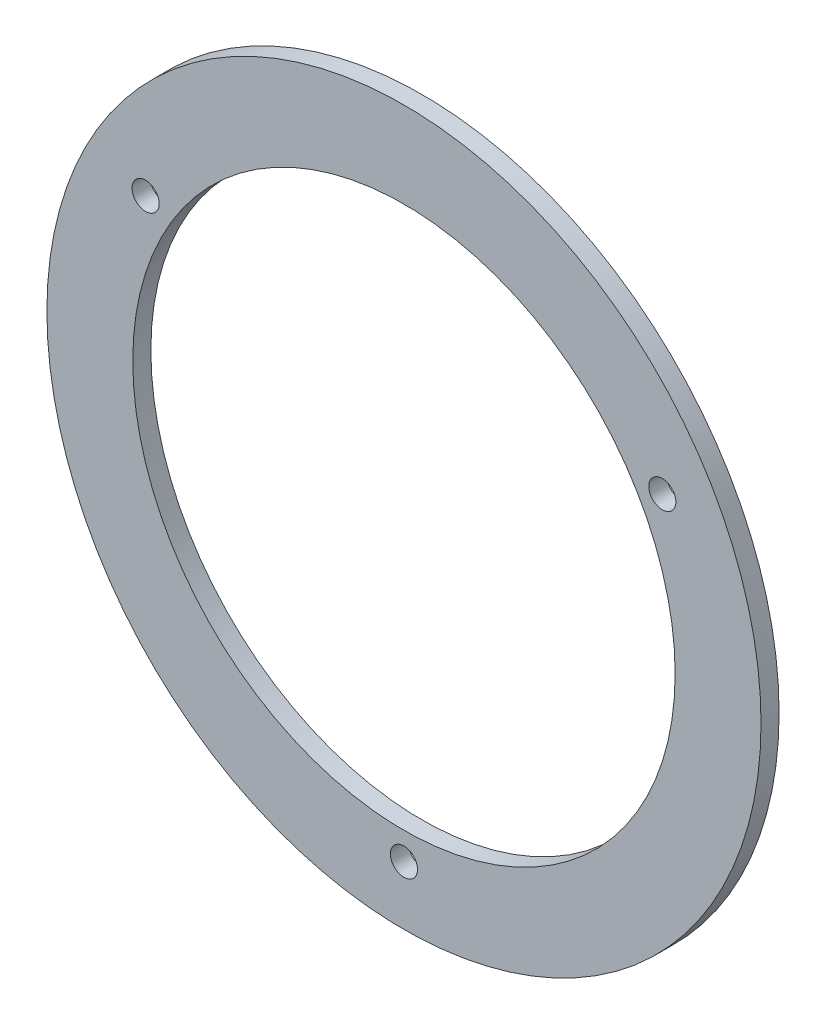
ISO-10303-21;
HEADER;
FILE_DESCRIPTION(('STEP AP214'),'2;1');
FILE_NAME('part.step','',(''),(''),'','','');
FILE_SCHEMA(('AUTOMOTIVE_DESIGN { 1 0 10303 214 1 1 1 1 }'));
ENDSEC;
DATA;
#1=APPLICATION_CONTEXT('core data for automotive mechanical design processes');
#2=APPLICATION_PROTOCOL_DEFINITION('international standard','automotive_design',2000,#1);
#3=PRODUCT_CONTEXT('',#1,'mechanical');
#4=PRODUCT('Part','Part','',(#3));
#5=PRODUCT_RELATED_PRODUCT_CATEGORY('part','',(#4));
#6=PRODUCT_DEFINITION_FORMATION('','',#4);
#7=PRODUCT_DEFINITION_CONTEXT('part definition',#1,'design');
#8=PRODUCT_DEFINITION('design','',#6,#7);
#9=PRODUCT_DEFINITION_SHAPE('','',#8);
#10=(LENGTH_UNIT() NAMED_UNIT(*) SI_UNIT(.MILLI.,.METRE.));
#11=(NAMED_UNIT(*) PLANE_ANGLE_UNIT() SI_UNIT($,.RADIAN.));
#12=(NAMED_UNIT(*) SI_UNIT($,.STERADIAN.) SOLID_ANGLE_UNIT());
#13=UNCERTAINTY_MEASURE_WITH_UNIT(LENGTH_MEASURE(1.E-05),#10,'distance_accuracy_value','');
#14=(GEOMETRIC_REPRESENTATION_CONTEXT(3) GLOBAL_UNCERTAINTY_ASSIGNED_CONTEXT((#13)) GLOBAL_UNIT_ASSIGNED_CONTEXT((#10,
#11,#12)) REPRESENTATION_CONTEXT('',''));
#15=CARTESIAN_POINT('',(0.,0.,0.));
#16=DIRECTION('',(0.,0.,1.));
#17=DIRECTION('',(1.,0.,0.));
#18=AXIS2_PLACEMENT_3D('',#15,#16,#17);
#19=CARTESIAN_POINT('',(0.,0.,2.));
#20=DIRECTION('',(0.,0.,1.));
#21=DIRECTION('',(1.,0.,0.));
#22=AXIS2_PLACEMENT_3D('',#19,#20,#21);
#23=PLANE('',#22);
#24=CARTESIAN_POINT('',(0.,-33.,2.));
#25=DIRECTION('',(0.,0.,1.));
#26=DIRECTION('',(1.,0.,0.));
#27=AXIS2_PLACEMENT_3D('',#24,#25,#26);
#28=CIRCLE('',#27,1.5);
#29=CARTESIAN_POINT('',(1.5,-33.,2.));
#30=VERTEX_POINT('',#29);
#31=EDGE_CURVE('E61',#30,#30,#28,.T.);
#32=ORIENTED_EDGE('',*,*,#31,.F.);
#33=EDGE_LOOP('',(#32));
#34=FACE_BOUND('',#33,.T.);
#35=CARTESIAN_POINT('',(-28.5788383248864,16.5000000000001,2.));
#36=DIRECTION('',(0.,0.,1.));
#37=DIRECTION('',(1.,0.,0.));
#38=AXIS2_PLACEMENT_3D('',#35,#36,#37);
#39=CIRCLE('',#38,1.5);
#40=CARTESIAN_POINT('',(-27.0788383248864,16.5000000000001,2.));
#41=VERTEX_POINT('',#40);
#42=EDGE_CURVE('E55',#41,#41,#39,.T.);
#43=ORIENTED_EDGE('',*,*,#42,.F.);
#44=EDGE_LOOP('',(#43));
#45=FACE_BOUND('',#44,.T.);
#46=CARTESIAN_POINT('',(28.5788383248866,16.4999999999997,2.));
#47=DIRECTION('',(0.,0.,1.));
#48=DIRECTION('',(1.,0.,0.));
#49=AXIS2_PLACEMENT_3D('',#46,#47,#48);
#50=CIRCLE('',#49,1.5);
#51=CARTESIAN_POINT('',(30.0788383248866,16.4999999999997,2.));
#52=VERTEX_POINT('',#51);
#53=EDGE_CURVE('E49',#52,#52,#50,.T.);
#54=ORIENTED_EDGE('',*,*,#53,.F.);
#55=EDGE_LOOP('',(#54));
#56=FACE_BOUND('',#55,.T.);
#57=CARTESIAN_POINT('',(0.,0.,2.));
#58=DIRECTION('',(0.,0.,1.));
#59=DIRECTION('',(1.,0.,0.));
#60=AXIS2_PLACEMENT_3D('',#57,#58,#59);
#61=CIRCLE('',#60,39.5);
#62=CARTESIAN_POINT('',(39.5,0.,2.));
#63=VERTEX_POINT('',#62);
#64=EDGE_CURVE('E10',#63,#63,#61,.T.);
#65=ORIENTED_EDGE('',*,*,#64,.T.);
#66=EDGE_LOOP('',(#65));
#67=FACE_BOUND('',#66,.T.);
#68=CARTESIAN_POINT('',(0.,0.,2.));
#69=DIRECTION('',(0.,0.,1.));
#70=DIRECTION('',(1.,0.,0.));
#71=AXIS2_PLACEMENT_3D('',#68,#69,#70);
#72=CIRCLE('',#71,30.);
#73=CARTESIAN_POINT('',(30.,0.,2.));
#74=VERTEX_POINT('',#73);
#75=EDGE_CURVE('E41',#74,#74,#72,.T.);
#76=ORIENTED_EDGE('',*,*,#75,.F.);
#77=EDGE_LOOP('',(#76));
#78=FACE_BOUND('',#77,.T.);
#79=ADVANCED_FACE('F30',(#34,#45,#56,#67,#78),#23,.T.);
#80=CARTESIAN_POINT('',(0.,0.,0.));
#81=DIRECTION('',(0.,0.,1.));
#82=DIRECTION('',(1.,0.,0.));
#83=AXIS2_PLACEMENT_3D('',#80,#81,#82);
#84=PLANE('',#83);
#85=CARTESIAN_POINT('',(0.,-33.,0.));
#86=DIRECTION('',(0.,0.,1.));
#87=DIRECTION('',(1.,0.,0.));
#88=AXIS2_PLACEMENT_3D('',#85,#86,#87);
#89=CIRCLE('',#88,1.5);
#90=CARTESIAN_POINT('',(1.5,-33.,0.));
#91=VERTEX_POINT('',#90);
#92=EDGE_CURVE('E46',#91,#91,#89,.T.);
#93=ORIENTED_EDGE('',*,*,#92,.T.);
#94=EDGE_LOOP('',(#93));
#95=FACE_BOUND('',#94,.T.);
#96=CARTESIAN_POINT('',(-28.5788383248864,16.5000000000001,0.));
#97=DIRECTION('',(0.,0.,1.));
#98=DIRECTION('',(1.,0.,0.));
#99=AXIS2_PLACEMENT_3D('',#96,#97,#98);
#100=CIRCLE('',#99,1.5);
#101=CARTESIAN_POINT('',(-27.0788383248864,16.5000000000001,0.));
#102=VERTEX_POINT('',#101);
#103=EDGE_CURVE('E58',#102,#102,#100,.T.);
#104=ORIENTED_EDGE('',*,*,#103,.T.);
#105=EDGE_LOOP('',(#104));
#106=FACE_BOUND('',#105,.T.);
#107=CARTESIAN_POINT('',(28.5788383248866,16.4999999999997,0.));
#108=DIRECTION('',(0.,0.,1.));
#109=DIRECTION('',(1.,0.,0.));
#110=AXIS2_PLACEMENT_3D('',#107,#108,#109);
#111=CIRCLE('',#110,1.5);
#112=CARTESIAN_POINT('',(30.0788383248866,16.4999999999997,0.));
#113=VERTEX_POINT('',#112);
#114=EDGE_CURVE('E52',#113,#113,#111,.T.);
#115=ORIENTED_EDGE('',*,*,#114,.T.);
#116=EDGE_LOOP('',(#115));
#117=FACE_BOUND('',#116,.T.);
#118=CARTESIAN_POINT('',(0.,0.,0.));
#119=DIRECTION('',(0.,0.,1.));
#120=DIRECTION('',(1.,0.,0.));
#121=AXIS2_PLACEMENT_3D('',#118,#119,#120);
#122=CIRCLE('',#121,39.5);
#123=CARTESIAN_POINT('',(39.5,0.,0.));
#124=VERTEX_POINT('',#123);
#125=EDGE_CURVE('E34',#124,#124,#122,.T.);
#126=ORIENTED_EDGE('',*,*,#125,.F.);
#127=EDGE_LOOP('',(#126));
#128=FACE_BOUND('',#127,.T.);
#129=CARTESIAN_POINT('',(0.,0.,0.));
#130=DIRECTION('',(0.,0.,1.));
#131=DIRECTION('',(1.,0.,0.));
#132=AXIS2_PLACEMENT_3D('',#129,#130,#131);
#133=CIRCLE('',#132,30.);
#134=CARTESIAN_POINT('',(30.,0.,0.));
#135=VERTEX_POINT('',#134);
#136=EDGE_CURVE('E43',#135,#135,#133,.T.);
#137=ORIENTED_EDGE('',*,*,#136,.T.);
#138=EDGE_LOOP('',(#137));
#139=FACE_BOUND('',#138,.T.);
#140=ADVANCED_FACE('F67',(#95,#106,#117,#128,#139),#84,.F.);
#141=CARTESIAN_POINT('',(0.,0.,2.));
#142=DIRECTION('',(0.,0.,-1.));
#143=DIRECTION('',(-1.,0.,0.));
#144=AXIS2_PLACEMENT_3D('',#141,#142,#143);
#145=CYLINDRICAL_SURFACE('',#144,39.5);
#146=ORIENTED_EDGE('',*,*,#64,.F.);
#147=EDGE_LOOP('',(#146));
#148=FACE_BOUND('',#147,.T.);
#149=ORIENTED_EDGE('',*,*,#125,.T.);
#150=EDGE_LOOP('',(#149));
#151=FACE_BOUND('',#150,.T.);
#152=ADVANCED_FACE('F32',(#148,#151),#145,.T.);
#153=CARTESIAN_POINT('',(0.,0.,2.));
#154=DIRECTION('',(0.,0.,-1.));
#155=DIRECTION('',(-1.,0.,0.));
#156=AXIS2_PLACEMENT_3D('',#153,#154,#155);
#157=CYLINDRICAL_SURFACE('',#156,30.);
#158=ORIENTED_EDGE('',*,*,#75,.T.);
#159=EDGE_LOOP('',(#158));
#160=FACE_BOUND('',#159,.T.);
#161=ORIENTED_EDGE('',*,*,#136,.F.);
#162=EDGE_LOOP('',(#161));
#163=FACE_BOUND('',#162,.T.);
#164=ADVANCED_FACE('F86',(#160,#163),#157,.F.);
#165=CARTESIAN_POINT('',(28.5788383248866,16.4999999999997,0.));
#166=DIRECTION('',(0.,0.,1.));
#167=DIRECTION('',(1.,0.,0.));
#168=AXIS2_PLACEMENT_3D('',#165,#166,#167);
#169=CYLINDRICAL_SURFACE('',#168,1.5);
#170=ORIENTED_EDGE('',*,*,#114,.F.);
#171=EDGE_LOOP('',(#170));
#172=FACE_BOUND('',#171,.T.);
#173=ORIENTED_EDGE('',*,*,#53,.T.);
#174=EDGE_LOOP('',(#173));
#175=FACE_BOUND('',#174,.T.);
#176=ADVANCED_FACE('F89',(#172,#175),#169,.F.);
#177=CARTESIAN_POINT('',(-28.5788383248864,16.5000000000001,0.));
#178=DIRECTION('',(0.,0.,1.));
#179=DIRECTION('',(1.,0.,0.));
#180=AXIS2_PLACEMENT_3D('',#177,#178,#179);
#181=CYLINDRICAL_SURFACE('',#180,1.5);
#182=ORIENTED_EDGE('',*,*,#103,.F.);
#183=EDGE_LOOP('',(#182));
#184=FACE_BOUND('',#183,.T.);
#185=ORIENTED_EDGE('',*,*,#42,.T.);
#186=EDGE_LOOP('',(#185));
#187=FACE_BOUND('',#186,.T.);
#188=ADVANCED_FACE('F73',(#184,#187),#181,.F.);
#189=CARTESIAN_POINT('',(0.,-33.,0.));
#190=DIRECTION('',(0.,0.,1.));
#191=DIRECTION('',(1.,0.,0.));
#192=AXIS2_PLACEMENT_3D('',#189,#190,#191);
#193=CYLINDRICAL_SURFACE('',#192,1.5);
#194=ORIENTED_EDGE('',*,*,#92,.F.);
#195=EDGE_LOOP('',(#194));
#196=FACE_BOUND('',#195,.T.);
#197=ORIENTED_EDGE('',*,*,#31,.T.);
#198=EDGE_LOOP('',(#197));
#199=FACE_BOUND('',#198,.T.);
#200=ADVANCED_FACE('F70',(#196,#199),#193,.F.);
#201=CLOSED_SHELL('',(#79,#140,#152,#164,#176,#188,#200));
#202=MANIFOLD_SOLID_BREP('B2',#201);
#203=ADVANCED_BREP_SHAPE_REPRESENTATION('',(#18,#202),#14);
#204=SHAPE_DEFINITION_REPRESENTATION(#9,#203);
ENDSEC;
END-ISO-10303-21;
